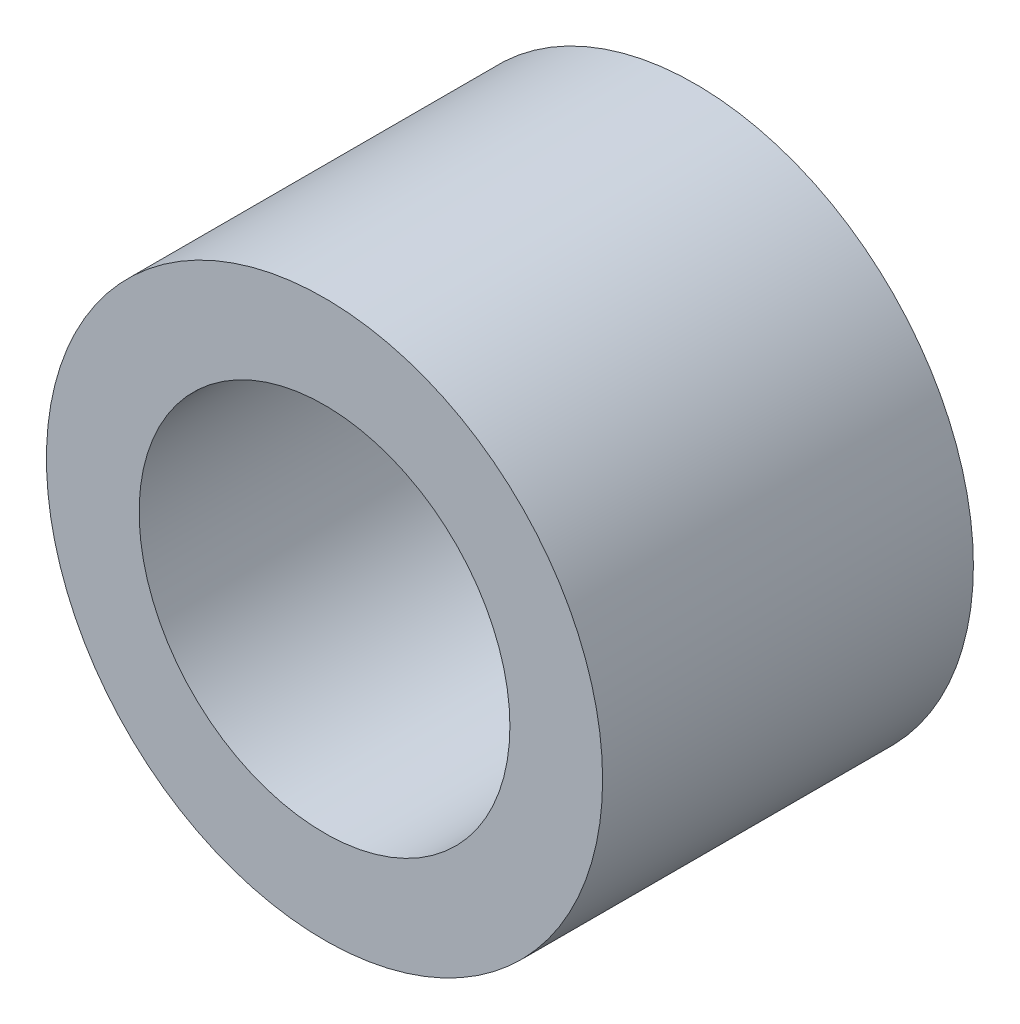
ISO-10303-21;
HEADER;
FILE_DESCRIPTION(('STEP AP214'),'2;1');
FILE_NAME('part.step','',(''),(''),'','','');
FILE_SCHEMA(('AUTOMOTIVE_DESIGN { 1 0 10303 214 1 1 1 1 }'));
ENDSEC;
DATA;
#1=APPLICATION_CONTEXT('core data for automotive mechanical design processes');
#2=APPLICATION_PROTOCOL_DEFINITION('international standard','automotive_design',2000,#1);
#3=PRODUCT_CONTEXT('',#1,'mechanical');
#4=PRODUCT('Part','Part','',(#3));
#5=PRODUCT_RELATED_PRODUCT_CATEGORY('part','',(#4));
#6=PRODUCT_DEFINITION_FORMATION('','',#4);
#7=PRODUCT_DEFINITION_CONTEXT('part definition',#1,'design');
#8=PRODUCT_DEFINITION('design','',#6,#7);
#9=PRODUCT_DEFINITION_SHAPE('','',#8);
#10=(LENGTH_UNIT() NAMED_UNIT(*) SI_UNIT(.MILLI.,.METRE.));
#11=(NAMED_UNIT(*) PLANE_ANGLE_UNIT() SI_UNIT($,.RADIAN.));
#12=(NAMED_UNIT(*) SI_UNIT($,.STERADIAN.) SOLID_ANGLE_UNIT());
#13=UNCERTAINTY_MEASURE_WITH_UNIT(LENGTH_MEASURE(1.E-05),#10,'distance_accuracy_value','');
#14=(GEOMETRIC_REPRESENTATION_CONTEXT(3) GLOBAL_UNCERTAINTY_ASSIGNED_CONTEXT((#13)) GLOBAL_UNIT_ASSIGNED_CONTEXT((#10,
#11,#12)) REPRESENTATION_CONTEXT('',''));
#15=CARTESIAN_POINT('',(0.,0.,0.));
#16=DIRECTION('',(0.,0.,1.));
#17=DIRECTION('',(1.,0.,0.));
#18=AXIS2_PLACEMENT_3D('',#15,#16,#17);
#19=CARTESIAN_POINT('',(0.,0.,4.));
#20=DIRECTION('',(0.,0.,-1.));
#21=DIRECTION('',(-1.,0.,0.));
#22=AXIS2_PLACEMENT_3D('',#19,#20,#21);
#23=CYLINDRICAL_SURFACE('',#22,3.);
#24=CARTESIAN_POINT('',(0.,0.,4.));
#25=DIRECTION('',(0.,0.,1.));
#26=DIRECTION('',(1.,0.,0.));
#27=AXIS2_PLACEMENT_3D('',#24,#25,#26);
#28=CIRCLE('',#27,3.);
#29=CARTESIAN_POINT('',(3.,0.,4.));
#30=VERTEX_POINT('',#29);
#31=EDGE_CURVE('E10',#30,#30,#28,.T.);
#32=ORIENTED_EDGE('',*,*,#31,.F.);
#33=EDGE_LOOP('',(#32));
#34=FACE_BOUND('',#33,.T.);
#35=CARTESIAN_POINT('',(0.,0.,0.));
#36=DIRECTION('',(0.,0.,1.));
#37=DIRECTION('',(1.,0.,0.));
#38=AXIS2_PLACEMENT_3D('',#35,#36,#37);
#39=CIRCLE('',#38,3.);
#40=CARTESIAN_POINT('',(3.,0.,0.));
#41=VERTEX_POINT('',#40);
#42=EDGE_CURVE('E42',#41,#41,#39,.T.);
#43=ORIENTED_EDGE('',*,*,#42,.T.);
#44=EDGE_LOOP('',(#43));
#45=FACE_BOUND('',#44,.T.);
#46=ADVANCED_FACE('F39',(#34,#45),#23,.T.);
#47=CARTESIAN_POINT('',(0.,0.,4.));
#48=DIRECTION('',(0.,0.,1.));
#49=DIRECTION('',(1.,0.,0.));
#50=AXIS2_PLACEMENT_3D('',#47,#48,#49);
#51=PLANE('',#50);
#52=CARTESIAN_POINT('',(0.,0.,4.));
#53=DIRECTION('',(0.,0.,1.));
#54=DIRECTION('',(1.,0.,0.));
#55=AXIS2_PLACEMENT_3D('',#52,#53,#54);
#56=CIRCLE('',#55,2.);
#57=CARTESIAN_POINT('',(2.,0.,4.));
#58=VERTEX_POINT('',#57);
#59=EDGE_CURVE('E51',#58,#58,#56,.T.);
#60=ORIENTED_EDGE('',*,*,#59,.F.);
#61=EDGE_LOOP('',(#60));
#62=FACE_BOUND('',#61,.T.);
#63=ORIENTED_EDGE('',*,*,#31,.T.);
#64=EDGE_LOOP('',(#63));
#65=FACE_BOUND('',#64,.T.);
#66=ADVANCED_FACE('F66',(#62,#65),#51,.T.);
#67=CARTESIAN_POINT('',(0.,0.,0.));
#68=DIRECTION('',(0.,0.,1.));
#69=DIRECTION('',(1.,0.,0.));
#70=AXIS2_PLACEMENT_3D('',#67,#68,#69);
#71=PLANE('',#70);
#72=CARTESIAN_POINT('',(0.,0.,0.));
#73=DIRECTION('',(0.,0.,1.));
#74=DIRECTION('',(1.,0.,0.));
#75=AXIS2_PLACEMENT_3D('',#72,#73,#74);
#76=CIRCLE('',#75,2.);
#77=CARTESIAN_POINT('',(2.,0.,0.));
#78=VERTEX_POINT('',#77);
#79=EDGE_CURVE('E49',#78,#78,#76,.T.);
#80=ORIENTED_EDGE('',*,*,#79,.T.);
#81=EDGE_LOOP('',(#80));
#82=FACE_BOUND('',#81,.T.);
#83=ORIENTED_EDGE('',*,*,#42,.F.);
#84=EDGE_LOOP('',(#83));
#85=FACE_BOUND('',#84,.T.);
#86=ADVANCED_FACE('F57',(#82,#85),#71,.F.);
#87=CARTESIAN_POINT('',(0.,0.,0.));
#88=DIRECTION('',(0.,0.,1.));
#89=DIRECTION('',(1.,0.,0.));
#90=AXIS2_PLACEMENT_3D('',#87,#88,#89);
#91=CYLINDRICAL_SURFACE('',#90,2.);
#92=ORIENTED_EDGE('',*,*,#79,.F.);
#93=EDGE_LOOP('',(#92));
#94=FACE_BOUND('',#93,.T.);
#95=ORIENTED_EDGE('',*,*,#59,.T.);
#96=EDGE_LOOP('',(#95));
#97=FACE_BOUND('',#96,.T.);
#98=ADVANCED_FACE('F60',(#94,#97),#91,.F.);
#99=CLOSED_SHELL('',(#46,#66,#86,#98));
#100=MANIFOLD_SOLID_BREP('B2',#99);
#101=ADVANCED_BREP_SHAPE_REPRESENTATION('',(#18,#100),#14);
#102=SHAPE_DEFINITION_REPRESENTATION(#9,#101);
ENDSEC;
END-ISO-10303-21;
